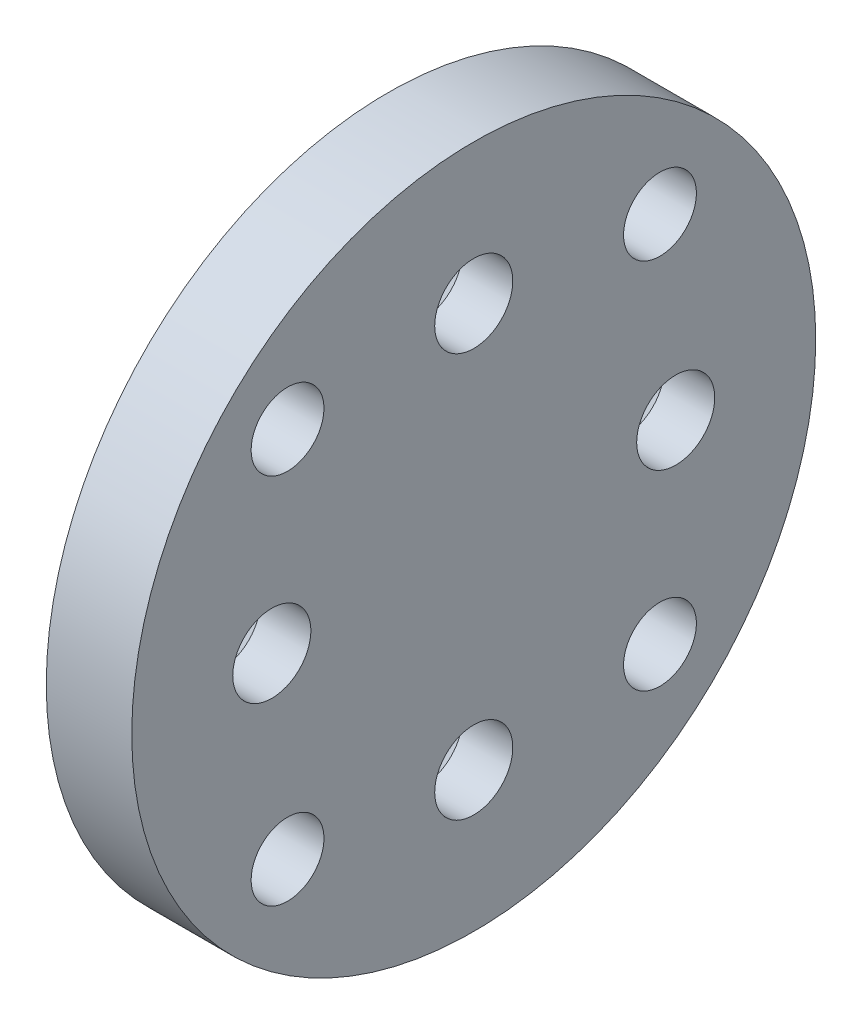
ISO-10303-21;
HEADER;
FILE_DESCRIPTION(('STEP AP214'),'2;1');
FILE_NAME('part.step','',(''),(''),'','','');
FILE_SCHEMA(('AUTOMOTIVE_DESIGN { 1 0 10303 214 1 1 1 1 }'));
ENDSEC;
DATA;
#1=APPLICATION_CONTEXT('core data for automotive mechanical design processes');
#2=APPLICATION_PROTOCOL_DEFINITION('international standard','automotive_design',2000,#1);
#3=PRODUCT_CONTEXT('',#1,'mechanical');
#4=PRODUCT('Part','Part','',(#3));
#5=PRODUCT_RELATED_PRODUCT_CATEGORY('part','',(#4));
#6=PRODUCT_DEFINITION_FORMATION('','',#4);
#7=PRODUCT_DEFINITION_CONTEXT('part definition',#1,'design');
#8=PRODUCT_DEFINITION('design','',#6,#7);
#9=PRODUCT_DEFINITION_SHAPE('','',#8);
#10=(LENGTH_UNIT() NAMED_UNIT(*) SI_UNIT(.MILLI.,.METRE.));
#11=(NAMED_UNIT(*) PLANE_ANGLE_UNIT() SI_UNIT($,.RADIAN.));
#12=(NAMED_UNIT(*) SI_UNIT($,.STERADIAN.) SOLID_ANGLE_UNIT());
#13=UNCERTAINTY_MEASURE_WITH_UNIT(LENGTH_MEASURE(1.E-05),#10,'distance_accuracy_value','');
#14=(GEOMETRIC_REPRESENTATION_CONTEXT(3) GLOBAL_UNCERTAINTY_ASSIGNED_CONTEXT((#13)) GLOBAL_UNIT_ASSIGNED_CONTEXT((#10,
#11,#12)) REPRESENTATION_CONTEXT('',''));
#15=CARTESIAN_POINT('',(0.,0.,0.));
#16=DIRECTION('',(0.,0.,1.));
#17=DIRECTION('',(1.,0.,0.));
#18=AXIS2_PLACEMENT_3D('',#15,#16,#17);
#19=CARTESIAN_POINT('',(3.175,0.,0.));
#20=DIRECTION('',(-1.,0.,0.));
#21=DIRECTION('',(0.,0.,1.));
#22=AXIS2_PLACEMENT_3D('',#19,#20,#21);
#23=CYLINDRICAL_SURFACE('',#22,12.7);
#24=CARTESIAN_POINT('',(3.175,0.,0.));
#25=DIRECTION('',(1.,0.,0.));
#26=DIRECTION('',(0.,0.,-1.));
#27=AXIS2_PLACEMENT_3D('',#24,#25,#26);
#28=CIRCLE('',#27,12.7);
#29=CARTESIAN_POINT('',(3.175,0.,-12.7));
#30=VERTEX_POINT('',#29);
#31=EDGE_CURVE('E10',#30,#30,#28,.T.);
#32=ORIENTED_EDGE('',*,*,#31,.F.);
#33=EDGE_LOOP('',(#32));
#34=FACE_BOUND('',#33,.T.);
#35=CARTESIAN_POINT('',(0.,0.,0.));
#36=DIRECTION('',(1.,0.,0.));
#37=DIRECTION('',(0.,0.,-1.));
#38=AXIS2_PLACEMENT_3D('',#35,#36,#37);
#39=CIRCLE('',#38,12.7);
#40=CARTESIAN_POINT('',(0.,0.,-12.7));
#41=VERTEX_POINT('',#40);
#42=EDGE_CURVE('E34',#41,#41,#39,.T.);
#43=ORIENTED_EDGE('',*,*,#42,.T.);
#44=EDGE_LOOP('',(#43));
#45=FACE_BOUND('',#44,.T.);
#46=ADVANCED_FACE('F31',(#34,#45),#23,.T.);
#47=CARTESIAN_POINT('',(3.175,0.,0.));
#48=DIRECTION('',(1.,0.,0.));
#49=DIRECTION('',(0.,0.,-1.));
#50=AXIS2_PLACEMENT_3D('',#47,#48,#49);
#51=PLANE('',#50);
#52=CARTESIAN_POINT('',(3.175,6.91479721322325,-6.91479721322325));
#53=DIRECTION('',(-1.,0.,0.));
#54=DIRECTION('',(0.,0.,1.));
#55=AXIS2_PLACEMENT_3D('',#52,#53,#54);
#56=CIRCLE('',#55,1.35255);
#57=CARTESIAN_POINT('',(3.175,6.91479721322325,-5.56224721322325));
#58=VERTEX_POINT('',#57);
#59=EDGE_CURVE('E96',#58,#58,#56,.T.);
#60=ORIENTED_EDGE('',*,*,#59,.T.);
#61=EDGE_LOOP('',(#60));
#62=FACE_BOUND('',#61,.T.);
#63=CARTESIAN_POINT('',(3.175,-6.91479721322325,-6.91479721322325));
#64=DIRECTION('',(-1.,0.,0.));
#65=DIRECTION('',(0.,0.,1.));
#66=AXIS2_PLACEMENT_3D('',#63,#64,#65);
#67=CIRCLE('',#66,1.35255);
#68=CARTESIAN_POINT('',(3.175,-6.91479721322325,-5.56224721322325));
#69=VERTEX_POINT('',#68);
#70=EDGE_CURVE('E90',#69,#69,#67,.T.);
#71=ORIENTED_EDGE('',*,*,#70,.T.);
#72=EDGE_LOOP('',(#71));
#73=FACE_BOUND('',#72,.T.);
#74=CARTESIAN_POINT('',(3.175,6.91479721322325,6.91479721322325));
#75=DIRECTION('',(-1.,0.,0.));
#76=DIRECTION('',(0.,0.,1.));
#77=AXIS2_PLACEMENT_3D('',#74,#75,#76);
#78=CIRCLE('',#77,1.35255);
#79=CARTESIAN_POINT('',(3.175,6.91479721322325,8.26734721322325));
#80=VERTEX_POINT('',#79);
#81=EDGE_CURVE('E84',#80,#80,#78,.T.);
#82=ORIENTED_EDGE('',*,*,#81,.T.);
#83=EDGE_LOOP('',(#82));
#84=FACE_BOUND('',#83,.T.);
#85=CARTESIAN_POINT('',(3.175,-6.91479721322325,6.91479721322325));
#86=DIRECTION('',(-1.,0.,0.));
#87=DIRECTION('',(0.,0.,1.));
#88=AXIS2_PLACEMENT_3D('',#85,#86,#87);
#89=CIRCLE('',#88,1.35255);
#90=CARTESIAN_POINT('',(3.175,-6.91479721322325,8.26734721322325));
#91=VERTEX_POINT('',#90);
#92=EDGE_CURVE('E78',#91,#91,#89,.T.);
#93=ORIENTED_EDGE('',*,*,#92,.T.);
#94=EDGE_LOOP('',(#93));
#95=FACE_BOUND('',#94,.T.);
#96=CARTESIAN_POINT('',(3.175,7.5,0.));
#97=DIRECTION('',(-1.,0.,0.));
#98=DIRECTION('',(0.,0.,1.));
#99=AXIS2_PLACEMENT_3D('',#96,#97,#98);
#100=CIRCLE('',#99,1.45);
#101=CARTESIAN_POINT('',(3.175,7.5,1.45));
#102=VERTEX_POINT('',#101);
#103=EDGE_CURVE('E69',#102,#102,#100,.T.);
#104=ORIENTED_EDGE('',*,*,#103,.T.);
#105=EDGE_LOOP('',(#104));
#106=FACE_BOUND('',#105,.T.);
#107=CARTESIAN_POINT('',(3.175,-7.5,0.));
#108=DIRECTION('',(-1.,0.,0.));
#109=DIRECTION('',(0.,0.,1.));
#110=AXIS2_PLACEMENT_3D('',#107,#108,#109);
#111=CIRCLE('',#110,1.45);
#112=CARTESIAN_POINT('',(3.175,-7.5,1.45));
#113=VERTEX_POINT('',#112);
#114=EDGE_CURVE('E60',#113,#113,#111,.T.);
#115=ORIENTED_EDGE('',*,*,#114,.T.);
#116=EDGE_LOOP('',(#115));
#117=FACE_BOUND('',#116,.T.);
#118=CARTESIAN_POINT('',(3.175,0.,7.5));
#119=DIRECTION('',(-1.,0.,0.));
#120=DIRECTION('',(0.,0.,1.));
#121=AXIS2_PLACEMENT_3D('',#118,#119,#120);
#122=CIRCLE('',#121,1.45);
#123=CARTESIAN_POINT('',(3.175,0.,8.95));
#124=VERTEX_POINT('',#123);
#125=EDGE_CURVE('E51',#124,#124,#122,.T.);
#126=ORIENTED_EDGE('',*,*,#125,.T.);
#127=EDGE_LOOP('',(#126));
#128=FACE_BOUND('',#127,.T.);
#129=CARTESIAN_POINT('',(3.175,0.,-7.5));
#130=DIRECTION('',(-1.,0.,0.));
#131=DIRECTION('',(0.,0.,1.));
#132=AXIS2_PLACEMENT_3D('',#129,#130,#131);
#133=CIRCLE('',#132,1.45);
#134=CARTESIAN_POINT('',(3.175,0.,-6.05));
#135=VERTEX_POINT('',#134);
#136=EDGE_CURVE('E41',#135,#135,#133,.T.);
#137=ORIENTED_EDGE('',*,*,#136,.T.);
#138=EDGE_LOOP('',(#137));
#139=FACE_BOUND('',#138,.T.);
#140=ORIENTED_EDGE('',*,*,#31,.T.);
#141=EDGE_LOOP('',(#140));
#142=FACE_BOUND('',#141,.T.);
#143=ADVANCED_FACE('F109',(#62,#73,#84,#95,#106,#117,#128,#139,#142),#51,.T.);
#144=CARTESIAN_POINT('',(0.,0.,0.));
#145=DIRECTION('',(1.,0.,0.));
#146=DIRECTION('',(0.,0.,-1.));
#147=AXIS2_PLACEMENT_3D('',#144,#145,#146);
#148=PLANE('',#147);
#149=CARTESIAN_POINT('',(0.,6.91479721322325,-6.91479721322325));
#150=DIRECTION('',(-1.,0.,0.));
#151=DIRECTION('',(0.,0.,1.));
#152=AXIS2_PLACEMENT_3D('',#149,#150,#151);
#153=CIRCLE('',#152,1.35254999999999);
#154=CARTESIAN_POINT('',(0.,6.91479721322325,-5.56224721322326));
#155=VERTEX_POINT('',#154);
#156=EDGE_CURVE('E99',#155,#155,#153,.T.);
#157=ORIENTED_EDGE('',*,*,#156,.F.);
#158=EDGE_LOOP('',(#157));
#159=FACE_BOUND('',#158,.T.);
#160=CARTESIAN_POINT('',(0.,-6.91479721322325,-6.91479721322325));
#161=DIRECTION('',(-1.,0.,0.));
#162=DIRECTION('',(0.,0.,1.));
#163=AXIS2_PLACEMENT_3D('',#160,#161,#162);
#164=CIRCLE('',#163,1.35254999999999);
#165=CARTESIAN_POINT('',(0.,-6.91479721322325,-5.56224721322326));
#166=VERTEX_POINT('',#165);
#167=EDGE_CURVE('E93',#166,#166,#164,.T.);
#168=ORIENTED_EDGE('',*,*,#167,.F.);
#169=EDGE_LOOP('',(#168));
#170=FACE_BOUND('',#169,.T.);
#171=CARTESIAN_POINT('',(0.,6.91479721322325,6.91479721322325));
#172=DIRECTION('',(-1.,0.,0.));
#173=DIRECTION('',(0.,0.,1.));
#174=AXIS2_PLACEMENT_3D('',#171,#172,#173);
#175=CIRCLE('',#174,1.35254999999999);
#176=CARTESIAN_POINT('',(0.,6.91479721322325,8.26734721322324));
#177=VERTEX_POINT('',#176);
#178=EDGE_CURVE('E87',#177,#177,#175,.T.);
#179=ORIENTED_EDGE('',*,*,#178,.F.);
#180=EDGE_LOOP('',(#179));
#181=FACE_BOUND('',#180,.T.);
#182=CARTESIAN_POINT('',(0.,-6.91479721322325,6.91479721322325));
#183=DIRECTION('',(-1.,0.,0.));
#184=DIRECTION('',(0.,0.,1.));
#185=AXIS2_PLACEMENT_3D('',#182,#183,#184);
#186=CIRCLE('',#185,1.35254999999999);
#187=CARTESIAN_POINT('',(0.,-6.91479721322325,8.26734721322323));
#188=VERTEX_POINT('',#187);
#189=EDGE_CURVE('E81',#188,#188,#186,.T.);
#190=ORIENTED_EDGE('',*,*,#189,.F.);
#191=EDGE_LOOP('',(#190));
#192=FACE_BOUND('',#191,.T.);
#193=CARTESIAN_POINT('',(0.,7.5,0.));
#194=DIRECTION('',(-1.,0.,0.));
#195=DIRECTION('',(0.,0.,1.));
#196=AXIS2_PLACEMENT_3D('',#193,#194,#195);
#197=CIRCLE('',#196,2.75);
#198=CARTESIAN_POINT('',(0.,7.5,2.75));
#199=VERTEX_POINT('',#198);
#200=EDGE_CURVE('E75',#199,#199,#197,.T.);
#201=ORIENTED_EDGE('',*,*,#200,.F.);
#202=EDGE_LOOP('',(#201));
#203=FACE_BOUND('',#202,.T.);
#204=CARTESIAN_POINT('',(0.,-7.5,0.));
#205=DIRECTION('',(-1.,0.,0.));
#206=DIRECTION('',(0.,0.,1.));
#207=AXIS2_PLACEMENT_3D('',#204,#205,#206);
#208=CIRCLE('',#207,2.75);
#209=CARTESIAN_POINT('',(0.,-7.5,2.75));
#210=VERTEX_POINT('',#209);
#211=EDGE_CURVE('E66',#210,#210,#208,.T.);
#212=ORIENTED_EDGE('',*,*,#211,.F.);
#213=EDGE_LOOP('',(#212));
#214=FACE_BOUND('',#213,.T.);
#215=CARTESIAN_POINT('',(0.,0.,7.5));
#216=DIRECTION('',(-1.,0.,0.));
#217=DIRECTION('',(0.,0.,1.));
#218=AXIS2_PLACEMENT_3D('',#215,#216,#217);
#219=CIRCLE('',#218,2.75);
#220=CARTESIAN_POINT('',(0.,0.,10.25));
#221=VERTEX_POINT('',#220);
#222=EDGE_CURVE('E57',#221,#221,#219,.T.);
#223=ORIENTED_EDGE('',*,*,#222,.F.);
#224=EDGE_LOOP('',(#223));
#225=FACE_BOUND('',#224,.T.);
#226=CARTESIAN_POINT('',(0.,0.,-7.5));
#227=DIRECTION('',(-1.,0.,0.));
#228=DIRECTION('',(0.,0.,1.));
#229=AXIS2_PLACEMENT_3D('',#226,#227,#228);
#230=CIRCLE('',#229,2.75);
#231=CARTESIAN_POINT('',(0.,0.,-4.75));
#232=VERTEX_POINT('',#231);
#233=EDGE_CURVE('E48',#232,#232,#230,.T.);
#234=ORIENTED_EDGE('',*,*,#233,.F.);
#235=EDGE_LOOP('',(#234));
#236=FACE_BOUND('',#235,.T.);
#237=ORIENTED_EDGE('',*,*,#42,.F.);
#238=EDGE_LOOP('',(#237));
#239=FACE_BOUND('',#238,.T.);
#240=ADVANCED_FACE('F105',(#159,#170,#181,#192,#203,#214,#225,#236,#239),#148,.F.);
#241=CARTESIAN_POINT('',(0.,0.,-7.5));
#242=DIRECTION('',(-1.,0.,0.));
#243=DIRECTION('',(0.,0.,1.));
#244=AXIS2_PLACEMENT_3D('',#241,#242,#243);
#245=CYLINDRICAL_SURFACE('',#244,1.45);
#246=ORIENTED_EDGE('',*,*,#136,.F.);
#247=EDGE_LOOP('',(#246));
#248=FACE_BOUND('',#247,.T.);
#249=CARTESIAN_POINT('',(1.3,0.,-7.5));
#250=DIRECTION('',(-1.,0.,0.));
#251=DIRECTION('',(0.,0.,1.));
#252=AXIS2_PLACEMENT_3D('',#249,#250,#251);
#253=CIRCLE('',#252,1.45);
#254=CARTESIAN_POINT('',(1.3,0.,-6.05));
#255=VERTEX_POINT('',#254);
#256=EDGE_CURVE('E45',#255,#255,#253,.T.);
#257=ORIENTED_EDGE('',*,*,#256,.T.);
#258=EDGE_LOOP('',(#257));
#259=FACE_BOUND('',#258,.T.);
#260=ADVANCED_FACE('F108',(#248,#259),#245,.F.);
#261=CARTESIAN_POINT('',(0.,0.,-7.5));
#262=DIRECTION('',(-1.,0.,0.));
#263=DIRECTION('',(0.,0.,1.));
#264=AXIS2_PLACEMENT_3D('',#261,#262,#263);
#265=CONICAL_SURFACE('',#264,2.75,0.785398163397449);
#266=ORIENTED_EDGE('',*,*,#256,.F.);
#267=EDGE_LOOP('',(#266));
#268=FACE_BOUND('',#267,.T.);
#269=ORIENTED_EDGE('',*,*,#233,.T.);
#270=EDGE_LOOP('',(#269));
#271=FACE_BOUND('',#270,.T.);
#272=ADVANCED_FACE('F140',(#268,#271),#265,.F.);
#273=CARTESIAN_POINT('',(0.,0.,7.5));
#274=DIRECTION('',(-1.,0.,0.));
#275=DIRECTION('',(0.,0.,1.));
#276=AXIS2_PLACEMENT_3D('',#273,#274,#275);
#277=CYLINDRICAL_SURFACE('',#276,1.45);
#278=ORIENTED_EDGE('',*,*,#125,.F.);
#279=EDGE_LOOP('',(#278));
#280=FACE_BOUND('',#279,.T.);
#281=CARTESIAN_POINT('',(1.3,0.,7.5));
#282=DIRECTION('',(-1.,0.,0.));
#283=DIRECTION('',(0.,0.,1.));
#284=AXIS2_PLACEMENT_3D('',#281,#282,#283);
#285=CIRCLE('',#284,1.45);
#286=CARTESIAN_POINT('',(1.3,0.,8.95));
#287=VERTEX_POINT('',#286);
#288=EDGE_CURVE('E54',#287,#287,#285,.T.);
#289=ORIENTED_EDGE('',*,*,#288,.T.);
#290=EDGE_LOOP('',(#289));
#291=FACE_BOUND('',#290,.T.);
#292=ADVANCED_FACE('F144',(#280,#291),#277,.F.);
#293=CARTESIAN_POINT('',(0.,0.,7.5));
#294=DIRECTION('',(-1.,0.,0.));
#295=DIRECTION('',(0.,0.,1.));
#296=AXIS2_PLACEMENT_3D('',#293,#294,#295);
#297=CONICAL_SURFACE('',#296,2.75,0.785398163397449);
#298=ORIENTED_EDGE('',*,*,#288,.F.);
#299=EDGE_LOOP('',(#298));
#300=FACE_BOUND('',#299,.T.);
#301=ORIENTED_EDGE('',*,*,#222,.T.);
#302=EDGE_LOOP('',(#301));
#303=FACE_BOUND('',#302,.T.);
#304=ADVANCED_FACE('F148',(#300,#303),#297,.F.);
#305=CARTESIAN_POINT('',(0.,-7.5,0.));
#306=DIRECTION('',(-1.,0.,0.));
#307=DIRECTION('',(0.,0.,1.));
#308=AXIS2_PLACEMENT_3D('',#305,#306,#307);
#309=CYLINDRICAL_SURFACE('',#308,1.45);
#310=ORIENTED_EDGE('',*,*,#114,.F.);
#311=EDGE_LOOP('',(#310));
#312=FACE_BOUND('',#311,.T.);
#313=CARTESIAN_POINT('',(1.3,-7.5,0.));
#314=DIRECTION('',(-1.,0.,0.));
#315=DIRECTION('',(0.,0.,1.));
#316=AXIS2_PLACEMENT_3D('',#313,#314,#315);
#317=CIRCLE('',#316,1.45);
#318=CARTESIAN_POINT('',(1.3,-7.5,1.45));
#319=VERTEX_POINT('',#318);
#320=EDGE_CURVE('E63',#319,#319,#317,.T.);
#321=ORIENTED_EDGE('',*,*,#320,.T.);
#322=EDGE_LOOP('',(#321));
#323=FACE_BOUND('',#322,.T.);
#324=ADVANCED_FACE('F152',(#312,#323),#309,.F.);
#325=CARTESIAN_POINT('',(0.,-7.5,0.));
#326=DIRECTION('',(-1.,0.,0.));
#327=DIRECTION('',(0.,0.,1.));
#328=AXIS2_PLACEMENT_3D('',#325,#326,#327);
#329=CONICAL_SURFACE('',#328,2.75,0.785398163397449);
#330=ORIENTED_EDGE('',*,*,#320,.F.);
#331=EDGE_LOOP('',(#330));
#332=FACE_BOUND('',#331,.T.);
#333=ORIENTED_EDGE('',*,*,#211,.T.);
#334=EDGE_LOOP('',(#333));
#335=FACE_BOUND('',#334,.T.);
#336=ADVANCED_FACE('F156',(#332,#335),#329,.F.);
#337=CARTESIAN_POINT('',(0.,7.5,0.));
#338=DIRECTION('',(-1.,0.,0.));
#339=DIRECTION('',(0.,0.,1.));
#340=AXIS2_PLACEMENT_3D('',#337,#338,#339);
#341=CYLINDRICAL_SURFACE('',#340,1.45);
#342=ORIENTED_EDGE('',*,*,#103,.F.);
#343=EDGE_LOOP('',(#342));
#344=FACE_BOUND('',#343,.T.);
#345=CARTESIAN_POINT('',(1.3,7.5,0.));
#346=DIRECTION('',(-1.,0.,0.));
#347=DIRECTION('',(0.,0.,1.));
#348=AXIS2_PLACEMENT_3D('',#345,#346,#347);
#349=CIRCLE('',#348,1.45);
#350=CARTESIAN_POINT('',(1.3,7.5,1.45));
#351=VERTEX_POINT('',#350);
#352=EDGE_CURVE('E72',#351,#351,#349,.T.);
#353=ORIENTED_EDGE('',*,*,#352,.T.);
#354=EDGE_LOOP('',(#353));
#355=FACE_BOUND('',#354,.T.);
#356=ADVANCED_FACE('F160',(#344,#355),#341,.F.);
#357=CARTESIAN_POINT('',(0.,7.5,0.));
#358=DIRECTION('',(-1.,0.,0.));
#359=DIRECTION('',(0.,0.,1.));
#360=AXIS2_PLACEMENT_3D('',#357,#358,#359);
#361=CONICAL_SURFACE('',#360,2.75,0.785398163397448);
#362=ORIENTED_EDGE('',*,*,#352,.F.);
#363=EDGE_LOOP('',(#362));
#364=FACE_BOUND('',#363,.T.);
#365=ORIENTED_EDGE('',*,*,#200,.T.);
#366=EDGE_LOOP('',(#365));
#367=FACE_BOUND('',#366,.T.);
#368=ADVANCED_FACE('F164',(#364,#367),#361,.F.);
#369=CARTESIAN_POINT('',(0.,-6.91479721322325,6.91479721322325));
#370=DIRECTION('',(-1.,0.,0.));
#371=DIRECTION('',(0.,0.,1.));
#372=AXIS2_PLACEMENT_3D('',#369,#370,#371);
#373=CYLINDRICAL_SURFACE('',#372,1.35254999999999);
#374=ORIENTED_EDGE('',*,*,#92,.F.);
#375=EDGE_LOOP('',(#374));
#376=FACE_BOUND('',#375,.T.);
#377=ORIENTED_EDGE('',*,*,#189,.T.);
#378=EDGE_LOOP('',(#377));
#379=FACE_BOUND('',#378,.T.);
#380=ADVANCED_FACE('F168',(#376,#379),#373,.F.);
#381=CARTESIAN_POINT('',(0.,6.91479721322325,6.91479721322325));
#382=DIRECTION('',(-1.,0.,0.));
#383=DIRECTION('',(0.,0.,1.));
#384=AXIS2_PLACEMENT_3D('',#381,#382,#383);
#385=CYLINDRICAL_SURFACE('',#384,1.35254999999999);
#386=ORIENTED_EDGE('',*,*,#81,.F.);
#387=EDGE_LOOP('',(#386));
#388=FACE_BOUND('',#387,.T.);
#389=ORIENTED_EDGE('',*,*,#178,.T.);
#390=EDGE_LOOP('',(#389));
#391=FACE_BOUND('',#390,.T.);
#392=ADVANCED_FACE('F172',(#388,#391),#385,.F.);
#393=CARTESIAN_POINT('',(0.,-6.91479721322325,-6.91479721322325));
#394=DIRECTION('',(-1.,0.,0.));
#395=DIRECTION('',(0.,0.,1.));
#396=AXIS2_PLACEMENT_3D('',#393,#394,#395);
#397=CYLINDRICAL_SURFACE('',#396,1.35254999999999);
#398=ORIENTED_EDGE('',*,*,#70,.F.);
#399=EDGE_LOOP('',(#398));
#400=FACE_BOUND('',#399,.T.);
#401=ORIENTED_EDGE('',*,*,#167,.T.);
#402=EDGE_LOOP('',(#401));
#403=FACE_BOUND('',#402,.T.);
#404=ADVANCED_FACE('F176',(#400,#403),#397,.F.);
#405=CARTESIAN_POINT('',(0.,6.91479721322325,-6.91479721322325));
#406=DIRECTION('',(-1.,0.,0.));
#407=DIRECTION('',(0.,0.,1.));
#408=AXIS2_PLACEMENT_3D('',#405,#406,#407);
#409=CYLINDRICAL_SURFACE('',#408,1.35254999999999);
#410=ORIENTED_EDGE('',*,*,#59,.F.);
#411=EDGE_LOOP('',(#410));
#412=FACE_BOUND('',#411,.T.);
#413=ORIENTED_EDGE('',*,*,#156,.T.);
#414=EDGE_LOOP('',(#413));
#415=FACE_BOUND('',#414,.T.);
#416=ADVANCED_FACE('F103',(#412,#415),#409,.F.);
#417=CLOSED_SHELL('',(#46,#143,#240,#260,#272,#292,#304,#324,#336,#356,#368,#380,#392,#404,#416));
#418=MANIFOLD_SOLID_BREP('B2',#417);
#419=ADVANCED_BREP_SHAPE_REPRESENTATION('',(#18,#418),#14);
#420=SHAPE_DEFINITION_REPRESENTATION(#9,#419);
ENDSEC;
END-ISO-10303-21;
